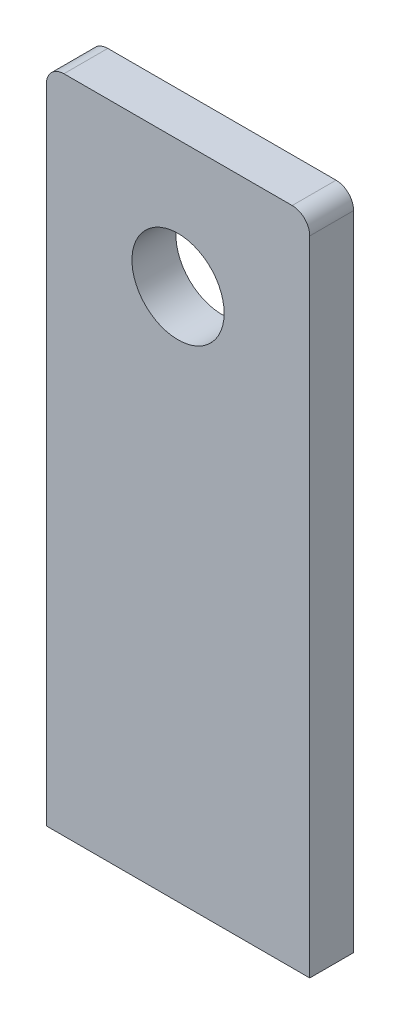
ISO-10303-21;
HEADER;
FILE_DESCRIPTION(('STEP AP214'),'2;1');
FILE_NAME('part.step','',(''),(''),'','','');
FILE_SCHEMA(('AUTOMOTIVE_DESIGN { 1 0 10303 214 1 1 1 1 }'));
ENDSEC;
DATA;
#1=APPLICATION_CONTEXT('core data for automotive mechanical design processes');
#2=APPLICATION_PROTOCOL_DEFINITION('international standard','automotive_design',2000,#1);
#3=PRODUCT_CONTEXT('',#1,'mechanical');
#4=PRODUCT('Part','Part','',(#3));
#5=PRODUCT_RELATED_PRODUCT_CATEGORY('part','',(#4));
#6=PRODUCT_DEFINITION_FORMATION('','',#4);
#7=PRODUCT_DEFINITION_CONTEXT('part definition',#1,'design');
#8=PRODUCT_DEFINITION('design','',#6,#7);
#9=PRODUCT_DEFINITION_SHAPE('','',#8);
#10=(LENGTH_UNIT() NAMED_UNIT(*) SI_UNIT(.MILLI.,.METRE.));
#11=(NAMED_UNIT(*) PLANE_ANGLE_UNIT() SI_UNIT($,.RADIAN.));
#12=(NAMED_UNIT(*) SI_UNIT($,.STERADIAN.) SOLID_ANGLE_UNIT());
#13=UNCERTAINTY_MEASURE_WITH_UNIT(LENGTH_MEASURE(1.E-05),#10,'distance_accuracy_value','');
#14=(GEOMETRIC_REPRESENTATION_CONTEXT(3) GLOBAL_UNCERTAINTY_ASSIGNED_CONTEXT((#13)) GLOBAL_UNIT_ASSIGNED_CONTEXT((#10,
#11,#12)) REPRESENTATION_CONTEXT('',''));
#15=CARTESIAN_POINT('',(0.,0.,0.));
#16=DIRECTION('',(0.,0.,1.));
#17=DIRECTION('',(1.,0.,0.));
#18=AXIS2_PLACEMENT_3D('',#15,#16,#17);
#19=CARTESIAN_POINT('',(0.,0.,2.5));
#20=DIRECTION('',(0.,0.,1.));
#21=DIRECTION('',(1.,0.,0.));
#22=AXIS2_PLACEMENT_3D('',#19,#20,#21);
#23=PLANE('',#22);
#24=DIRECTION('',(0.,1.,0.));
#25=VECTOR('',#24,1.);
#26=CARTESIAN_POINT('',(15.,37.6,2.5));
#27=LINE('',#26,#25);
#28=CARTESIAN_POINT('',(15.,-37.6,2.5));
#29=VERTEX_POINT('',#28);
#30=CARTESIAN_POINT('',(15.,35.6,2.5));
#31=VERTEX_POINT('',#30);
#32=EDGE_CURVE('E134',#29,#31,#27,.T.);
#33=ORIENTED_EDGE('',*,*,#32,.T.);
#34=CARTESIAN_POINT('',(13.,35.6,2.5));
#35=DIRECTION('',(0.,0.,1.));
#36=DIRECTION('',(1.,0.,0.));
#37=AXIS2_PLACEMENT_3D('',#34,#35,#36);
#38=CIRCLE('',#37,2.);
#39=CARTESIAN_POINT('',(13.,37.6,2.5));
#40=VERTEX_POINT('',#39);
#41=EDGE_CURVE('E47',#31,#40,#38,.T.);
#42=ORIENTED_EDGE('',*,*,#41,.T.);
#43=DIRECTION('',(-1.,0.,0.));
#44=VECTOR('',#43,1.);
#45=CARTESIAN_POINT('',(-15.,37.6,2.5));
#46=LINE('',#45,#44);
#47=CARTESIAN_POINT('',(-13.,37.6,2.5));
#48=VERTEX_POINT('',#47);
#49=EDGE_CURVE('E101',#40,#48,#46,.T.);
#50=ORIENTED_EDGE('',*,*,#49,.T.);
#51=CARTESIAN_POINT('',(-13.,35.6,2.5));
#52=DIRECTION('',(0.,0.,1.));
#53=DIRECTION('',(1.,0.,0.));
#54=AXIS2_PLACEMENT_3D('',#51,#52,#53);
#55=CIRCLE('',#54,2.);
#56=CARTESIAN_POINT('',(-15.,35.6,2.5));
#57=VERTEX_POINT('',#56);
#58=EDGE_CURVE('E54',#48,#57,#55,.T.);
#59=ORIENTED_EDGE('',*,*,#58,.T.);
#60=DIRECTION('',(0.,-1.,0.));
#61=VECTOR('',#60,1.);
#62=CARTESIAN_POINT('',(-15.,37.6,2.5));
#63=LINE('',#62,#61);
#64=CARTESIAN_POINT('',(-15.,-37.6,2.5));
#65=VERTEX_POINT('',#64);
#66=EDGE_CURVE('E92',#57,#65,#63,.T.);
#67=ORIENTED_EDGE('',*,*,#66,.T.);
#68=DIRECTION('',(1.,0.,0.));
#69=VECTOR('',#68,1.);
#70=CARTESIAN_POINT('',(-15.,-37.6,2.5));
#71=LINE('',#70,#69);
#72=EDGE_CURVE('E96',#65,#29,#71,.T.);
#73=ORIENTED_EDGE('',*,*,#72,.T.);
#74=EDGE_LOOP('',(#33,#42,#50,#59,#67,#73));
#75=FACE_BOUND('',#74,.T.);
#76=CARTESIAN_POINT('',(0.,23.1,2.5));
#77=DIRECTION('',(0.,0.,1.));
#78=DIRECTION('',(1.,0.,0.));
#79=AXIS2_PLACEMENT_3D('',#76,#77,#78);
#80=CIRCLE('',#79,5.25);
#81=CARTESIAN_POINT('',(5.25,23.1,2.5));
#82=VERTEX_POINT('',#81);
#83=EDGE_CURVE('E126',#82,#82,#80,.T.);
#84=ORIENTED_EDGE('',*,*,#83,.F.);
#85=EDGE_LOOP('',(#84));
#86=FACE_BOUND('',#85,.T.);
#87=ADVANCED_FACE('F38',(#75,#86),#23,.T.);
#88=CARTESIAN_POINT('',(0.,0.,-2.5));
#89=DIRECTION('',(0.,0.,1.));
#90=DIRECTION('',(1.,0.,0.));
#91=AXIS2_PLACEMENT_3D('',#88,#89,#90);
#92=PLANE('',#91);
#93=DIRECTION('',(-1.,0.,0.));
#94=VECTOR('',#93,1.);
#95=CARTESIAN_POINT('',(-15.,37.6,-2.5));
#96=LINE('',#95,#94);
#97=CARTESIAN_POINT('',(13.,37.6,-2.5));
#98=VERTEX_POINT('',#97);
#99=CARTESIAN_POINT('',(-13.,37.6,-2.5));
#100=VERTEX_POINT('',#99);
#101=EDGE_CURVE('E125',#98,#100,#96,.T.);
#102=ORIENTED_EDGE('',*,*,#101,.F.);
#103=CARTESIAN_POINT('',(13.,35.6,-2.5));
#104=DIRECTION('',(0.,0.,1.));
#105=DIRECTION('',(1.,0.,0.));
#106=AXIS2_PLACEMENT_3D('',#103,#104,#105);
#107=CIRCLE('',#106,2.);
#108=CARTESIAN_POINT('',(15.,35.6,-2.5));
#109=VERTEX_POINT('',#108);
#110=EDGE_CURVE('E145',#98,#109,#107,.F.);
#111=ORIENTED_EDGE('',*,*,#110,.T.);
#112=DIRECTION('',(0.,1.,0.));
#113=VECTOR('',#112,1.);
#114=CARTESIAN_POINT('',(15.,37.6,-2.5));
#115=LINE('',#114,#113);
#116=CARTESIAN_POINT('',(15.,-37.6,-2.5));
#117=VERTEX_POINT('',#116);
#118=EDGE_CURVE('E122',#117,#109,#115,.T.);
#119=ORIENTED_EDGE('',*,*,#118,.F.);
#120=DIRECTION('',(1.,0.,0.));
#121=VECTOR('',#120,1.);
#122=CARTESIAN_POINT('',(-15.,-37.6,-2.5));
#123=LINE('',#122,#121);
#124=CARTESIAN_POINT('',(-15.,-37.6,-2.5));
#125=VERTEX_POINT('',#124);
#126=EDGE_CURVE('E132',#125,#117,#123,.T.);
#127=ORIENTED_EDGE('',*,*,#126,.F.);
#128=DIRECTION('',(0.,-1.,0.));
#129=VECTOR('',#128,1.);
#130=CARTESIAN_POINT('',(-15.,37.6,-2.5));
#131=LINE('',#130,#129);
#132=CARTESIAN_POINT('',(-15.,35.6,-2.5));
#133=VERTEX_POINT('',#132);
#134=EDGE_CURVE('E107',#133,#125,#131,.T.);
#135=ORIENTED_EDGE('',*,*,#134,.F.);
#136=CARTESIAN_POINT('',(-13.,35.6,-2.5));
#137=DIRECTION('',(0.,0.,1.));
#138=DIRECTION('',(1.,0.,0.));
#139=AXIS2_PLACEMENT_3D('',#136,#137,#138);
#140=CIRCLE('',#139,2.);
#141=EDGE_CURVE('E142',#133,#100,#140,.F.);
#142=ORIENTED_EDGE('',*,*,#141,.T.);
#143=EDGE_LOOP('',(#102,#111,#119,#127,#135,#142));
#144=FACE_BOUND('',#143,.T.);
#145=CARTESIAN_POINT('',(0.,23.1,-2.5));
#146=DIRECTION('',(0.,0.,1.));
#147=DIRECTION('',(1.,0.,0.));
#148=AXIS2_PLACEMENT_3D('',#145,#146,#147);
#149=CIRCLE('',#148,5.25);
#150=CARTESIAN_POINT('',(5.25,23.1,-2.5));
#151=VERTEX_POINT('',#150);
#152=EDGE_CURVE('E170',#151,#151,#149,.T.);
#153=ORIENTED_EDGE('',*,*,#152,.T.);
#154=EDGE_LOOP('',(#153));
#155=FACE_BOUND('',#154,.T.);
#156=ADVANCED_FACE('F164',(#144,#155),#92,.F.);
#157=CARTESIAN_POINT('',(15.,37.6,2.5));
#158=DIRECTION('',(-1.,0.,0.));
#159=DIRECTION('',(0.,-1.,0.));
#160=AXIS2_PLACEMENT_3D('',#157,#158,#159);
#161=PLANE('',#160);
#162=ORIENTED_EDGE('',*,*,#118,.T.);
#163=DIRECTION('',(0.,0.,-1.));
#164=VECTOR('',#163,1.);
#165=CARTESIAN_POINT('',(15.,35.6,2.5));
#166=LINE('',#165,#164);
#167=EDGE_CURVE('E62',#109,#31,#166,.F.);
#168=ORIENTED_EDGE('',*,*,#167,.T.);
#169=ORIENTED_EDGE('',*,*,#32,.F.);
#170=DIRECTION('',(0.,0.,-1.));
#171=VECTOR('',#170,1.);
#172=CARTESIAN_POINT('',(15.,-37.6,2.5));
#173=LINE('',#172,#171);
#174=EDGE_CURVE('E112',#29,#117,#173,.T.);
#175=ORIENTED_EDGE('',*,*,#174,.T.);
#176=EDGE_LOOP('',(#162,#168,#169,#175));
#177=FACE_BOUND('',#176,.T.);
#178=ADVANCED_FACE('F166',(#177),#161,.F.);
#179=CARTESIAN_POINT('',(-15.,37.6,2.5));
#180=DIRECTION('',(0.,-1.,0.));
#181=DIRECTION('',(0.,0.,-1.));
#182=AXIS2_PLACEMENT_3D('',#179,#180,#181);
#183=PLANE('',#182);
#184=ORIENTED_EDGE('',*,*,#49,.F.);
#185=DIRECTION('',(0.,0.,-1.));
#186=VECTOR('',#185,1.);
#187=CARTESIAN_POINT('',(13.,37.6,2.5));
#188=LINE('',#187,#186);
#189=EDGE_CURVE('E138',#40,#98,#188,.T.);
#190=ORIENTED_EDGE('',*,*,#189,.T.);
#191=ORIENTED_EDGE('',*,*,#101,.T.);
#192=DIRECTION('',(0.,0.,-1.));
#193=VECTOR('',#192,1.);
#194=CARTESIAN_POINT('',(-13.,37.6,2.5));
#195=LINE('',#194,#193);
#196=EDGE_CURVE('E111',#100,#48,#195,.F.);
#197=ORIENTED_EDGE('',*,*,#196,.T.);
#198=EDGE_LOOP('',(#184,#190,#191,#197));
#199=FACE_BOUND('',#198,.T.);
#200=ADVANCED_FACE('F157',(#199),#183,.F.);
#201=CARTESIAN_POINT('',(-15.,37.6,2.5));
#202=DIRECTION('',(1.,0.,0.));
#203=DIRECTION('',(0.,1.,0.));
#204=AXIS2_PLACEMENT_3D('',#201,#202,#203);
#205=PLANE('',#204);
#206=ORIENTED_EDGE('',*,*,#66,.F.);
#207=DIRECTION('',(0.,0.,-1.));
#208=VECTOR('',#207,1.);
#209=CARTESIAN_POINT('',(-15.,35.6,2.5));
#210=LINE('',#209,#208);
#211=EDGE_CURVE('E11',#57,#133,#210,.T.);
#212=ORIENTED_EDGE('',*,*,#211,.T.);
#213=ORIENTED_EDGE('',*,*,#134,.T.);
#214=DIRECTION('',(0.,0.,-1.));
#215=VECTOR('',#214,1.);
#216=CARTESIAN_POINT('',(-15.,-37.6,2.5));
#217=LINE('',#216,#215);
#218=EDGE_CURVE('E104',#65,#125,#217,.T.);
#219=ORIENTED_EDGE('',*,*,#218,.F.);
#220=EDGE_LOOP('',(#206,#212,#213,#219));
#221=FACE_BOUND('',#220,.T.);
#222=ADVANCED_FACE('F105',(#221),#205,.F.);
#223=CARTESIAN_POINT('',(-15.,-37.6,2.5));
#224=DIRECTION('',(0.,1.,0.));
#225=DIRECTION('',(0.,0.,1.));
#226=AXIS2_PLACEMENT_3D('',#223,#224,#225);
#227=PLANE('',#226);
#228=ORIENTED_EDGE('',*,*,#126,.T.);
#229=ORIENTED_EDGE('',*,*,#174,.F.);
#230=ORIENTED_EDGE('',*,*,#72,.F.);
#231=ORIENTED_EDGE('',*,*,#218,.T.);
#232=EDGE_LOOP('',(#228,#229,#230,#231));
#233=FACE_BOUND('',#232,.T.);
#234=ADVANCED_FACE('F114',(#233),#227,.F.);
#235=CARTESIAN_POINT('',(0.,23.1,2.5));
#236=DIRECTION('',(0.,0.,-1.));
#237=DIRECTION('',(-1.,0.,0.));
#238=AXIS2_PLACEMENT_3D('',#235,#236,#237);
#239=CYLINDRICAL_SURFACE('',#238,5.25);
#240=ORIENTED_EDGE('',*,*,#83,.T.);
#241=EDGE_LOOP('',(#240));
#242=FACE_BOUND('',#241,.T.);
#243=ORIENTED_EDGE('',*,*,#152,.F.);
#244=EDGE_LOOP('',(#243));
#245=FACE_BOUND('',#244,.T.);
#246=ADVANCED_FACE('F178',(#242,#245),#239,.F.);
#247=CARTESIAN_POINT('',(13.,35.6,2.5));
#248=DIRECTION('',(0.,0.,-1.));
#249=DIRECTION('',(-1.,0.,0.));
#250=AXIS2_PLACEMENT_3D('',#247,#248,#249);
#251=CYLINDRICAL_SURFACE('',#250,2.);
#252=ORIENTED_EDGE('',*,*,#41,.F.);
#253=ORIENTED_EDGE('',*,*,#167,.F.);
#254=ORIENTED_EDGE('',*,*,#110,.F.);
#255=ORIENTED_EDGE('',*,*,#189,.F.);
#256=EDGE_LOOP('',(#252,#253,#254,#255));
#257=FACE_BOUND('',#256,.T.);
#258=ADVANCED_FACE('F161',(#257),#251,.T.);
#259=CARTESIAN_POINT('',(-13.,35.6,2.5));
#260=DIRECTION('',(0.,0.,-1.));
#261=DIRECTION('',(-1.,0.,0.));
#262=AXIS2_PLACEMENT_3D('',#259,#260,#261);
#263=CYLINDRICAL_SURFACE('',#262,2.);
#264=ORIENTED_EDGE('',*,*,#58,.F.);
#265=ORIENTED_EDGE('',*,*,#196,.F.);
#266=ORIENTED_EDGE('',*,*,#141,.F.);
#267=ORIENTED_EDGE('',*,*,#211,.F.);
#268=EDGE_LOOP('',(#264,#265,#266,#267));
#269=FACE_BOUND('',#268,.T.);
#270=ADVANCED_FACE('F40',(#269),#263,.T.);
#271=CLOSED_SHELL('',(#87,#156,#178,#200,#222,#234,#246,#258,#270));
#272=MANIFOLD_SOLID_BREP('B2',#271);
#273=ADVANCED_BREP_SHAPE_REPRESENTATION('',(#18,#272),#14);
#274=SHAPE_DEFINITION_REPRESENTATION(#9,#273);
ENDSEC;
END-ISO-10303-21;
